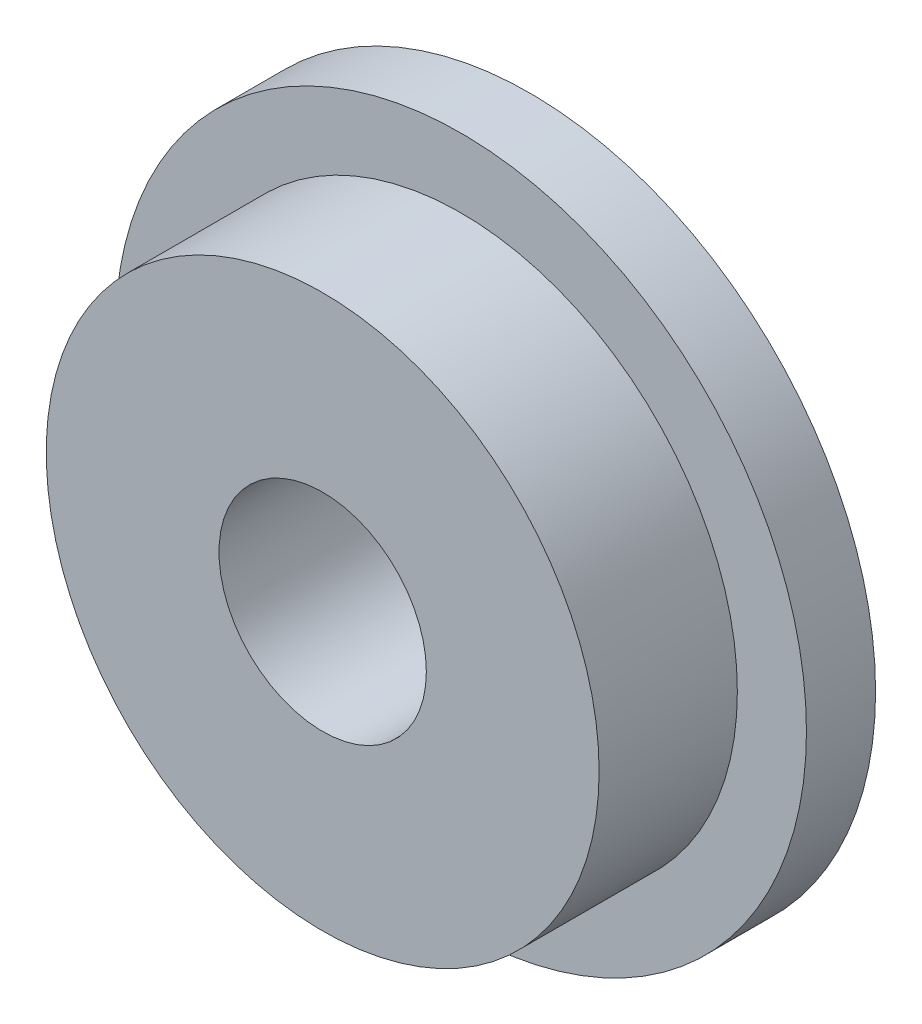
ISO-10303-21;
HEADER;
FILE_DESCRIPTION(('STEP AP214'),'2;1');
FILE_NAME('part.step','',(''),(''),'','','');
FILE_SCHEMA(('AUTOMOTIVE_DESIGN { 1 0 10303 214 1 1 1 1 }'));
ENDSEC;
DATA;
#1=APPLICATION_CONTEXT('core data for automotive mechanical design processes');
#2=APPLICATION_PROTOCOL_DEFINITION('international standard','automotive_design',2000,#1);
#3=PRODUCT_CONTEXT('',#1,'mechanical');
#4=PRODUCT('Part','Part','',(#3));
#5=PRODUCT_RELATED_PRODUCT_CATEGORY('part','',(#4));
#6=PRODUCT_DEFINITION_FORMATION('','',#4);
#7=PRODUCT_DEFINITION_CONTEXT('part definition',#1,'design');
#8=PRODUCT_DEFINITION('design','',#6,#7);
#9=PRODUCT_DEFINITION_SHAPE('','',#8);
#10=(LENGTH_UNIT() NAMED_UNIT(*) SI_UNIT(.MILLI.,.METRE.));
#11=(NAMED_UNIT(*) PLANE_ANGLE_UNIT() SI_UNIT($,.RADIAN.));
#12=(NAMED_UNIT(*) SI_UNIT($,.STERADIAN.) SOLID_ANGLE_UNIT());
#13=UNCERTAINTY_MEASURE_WITH_UNIT(LENGTH_MEASURE(1.E-05),#10,'distance_accuracy_value','');
#14=(GEOMETRIC_REPRESENTATION_CONTEXT(3) GLOBAL_UNCERTAINTY_ASSIGNED_CONTEXT((#13)) GLOBAL_UNIT_ASSIGNED_CONTEXT((#10,
#11,#12)) REPRESENTATION_CONTEXT('',''));
#15=CARTESIAN_POINT('',(0.,0.,0.));
#16=DIRECTION('',(0.,0.,1.));
#17=DIRECTION('',(1.,0.,0.));
#18=AXIS2_PLACEMENT_3D('',#15,#16,#17);
#19=CARTESIAN_POINT('',(0.,0.,1.));
#20=DIRECTION('',(0.,0.,1.));
#21=DIRECTION('',(1.,0.,0.));
#22=AXIS2_PLACEMENT_3D('',#19,#20,#21);
#23=PLANE('',#22);
#24=CARTESIAN_POINT('',(0.,0.,1.));
#25=DIRECTION('',(0.,0.,1.));
#26=DIRECTION('',(1.,0.,0.));
#27=AXIS2_PLACEMENT_3D('',#24,#25,#26);
#28=CIRCLE('',#27,5.);
#29=CARTESIAN_POINT('',(5.,0.,1.));
#30=VERTEX_POINT('',#29);
#31=EDGE_CURVE('E10',#30,#30,#28,.T.);
#32=ORIENTED_EDGE('',*,*,#31,.T.);
#33=EDGE_LOOP('',(#32));
#34=FACE_BOUND('',#33,.T.);
#35=CARTESIAN_POINT('',(0.,0.,1.));
#36=DIRECTION('',(0.,0.,1.));
#37=DIRECTION('',(1.,0.,0.));
#38=AXIS2_PLACEMENT_3D('',#35,#36,#37);
#39=CIRCLE('',#38,4.);
#40=CARTESIAN_POINT('',(4.,0.,1.));
#41=VERTEX_POINT('',#40);
#42=EDGE_CURVE('E48',#41,#41,#39,.T.);
#43=ORIENTED_EDGE('',*,*,#42,.F.);
#44=EDGE_LOOP('',(#43));
#45=FACE_BOUND('',#44,.T.);
#46=ADVANCED_FACE('F28',(#34,#45),#23,.T.);
#47=CARTESIAN_POINT('',(0.,0.,0.));
#48=DIRECTION('',(0.,0.,1.));
#49=DIRECTION('',(1.,0.,0.));
#50=AXIS2_PLACEMENT_3D('',#47,#48,#49);
#51=PLANE('',#50);
#52=CARTESIAN_POINT('',(0.,0.,0.));
#53=DIRECTION('',(0.,0.,1.));
#54=DIRECTION('',(1.,0.,0.));
#55=AXIS2_PLACEMENT_3D('',#52,#53,#54);
#56=CIRCLE('',#55,5.);
#57=CARTESIAN_POINT('',(5.,0.,0.));
#58=VERTEX_POINT('',#57);
#59=EDGE_CURVE('E35',#58,#58,#56,.T.);
#60=ORIENTED_EDGE('',*,*,#59,.F.);
#61=EDGE_LOOP('',(#60));
#62=FACE_BOUND('',#61,.T.);
#63=CARTESIAN_POINT('',(0.,0.,0.));
#64=DIRECTION('',(0.,0.,1.));
#65=DIRECTION('',(1.,0.,0.));
#66=AXIS2_PLACEMENT_3D('',#63,#64,#65);
#67=CIRCLE('',#66,1.5);
#68=CARTESIAN_POINT('',(1.5,0.,0.));
#69=VERTEX_POINT('',#68);
#70=EDGE_CURVE('E39',#69,#69,#67,.T.);
#71=ORIENTED_EDGE('',*,*,#70,.T.);
#72=EDGE_LOOP('',(#71));
#73=FACE_BOUND('',#72,.T.);
#74=ADVANCED_FACE('F70',(#62,#73),#51,.F.);
#75=CARTESIAN_POINT('',(0.,0.,1.));
#76=DIRECTION('',(0.,0.,-1.));
#77=DIRECTION('',(-1.,0.,0.));
#78=AXIS2_PLACEMENT_3D('',#75,#76,#77);
#79=CYLINDRICAL_SURFACE('',#78,5.);
#80=ORIENTED_EDGE('',*,*,#31,.F.);
#81=EDGE_LOOP('',(#80));
#82=FACE_BOUND('',#81,.T.);
#83=ORIENTED_EDGE('',*,*,#59,.T.);
#84=EDGE_LOOP('',(#83));
#85=FACE_BOUND('',#84,.T.);
#86=ADVANCED_FACE('F30',(#82,#85),#79,.T.);
#87=CARTESIAN_POINT('',(0.,0.,1.));
#88=DIRECTION('',(0.,0.,-1.));
#89=DIRECTION('',(-1.,0.,0.));
#90=AXIS2_PLACEMENT_3D('',#87,#88,#89);
#91=CYLINDRICAL_SURFACE('',#90,1.5);
#92=ORIENTED_EDGE('',*,*,#70,.F.);
#93=EDGE_LOOP('',(#92));
#94=FACE_BOUND('',#93,.T.);
#95=CARTESIAN_POINT('',(0.,0.,3.));
#96=DIRECTION('',(0.,0.,1.));
#97=DIRECTION('',(1.,0.,0.));
#98=AXIS2_PLACEMENT_3D('',#95,#96,#97);
#99=CIRCLE('',#98,1.5);
#100=CARTESIAN_POINT('',(1.5,0.,3.));
#101=VERTEX_POINT('',#100);
#102=EDGE_CURVE('E51',#101,#101,#99,.T.);
#103=ORIENTED_EDGE('',*,*,#102,.T.);
#104=EDGE_LOOP('',(#103));
#105=FACE_BOUND('',#104,.T.);
#106=ADVANCED_FACE('F55',(#94,#105),#91,.F.);
#107=CARTESIAN_POINT('',(0.,0.,3.));
#108=DIRECTION('',(0.,0.,-1.));
#109=DIRECTION('',(-1.,0.,0.));
#110=AXIS2_PLACEMENT_3D('',#107,#108,#109);
#111=CYLINDRICAL_SURFACE('',#110,4.);
#112=CARTESIAN_POINT('',(0.,0.,3.));
#113=DIRECTION('',(0.,0.,1.));
#114=DIRECTION('',(1.,0.,0.));
#115=AXIS2_PLACEMENT_3D('',#112,#113,#114);
#116=CIRCLE('',#115,4.);
#117=CARTESIAN_POINT('',(4.,0.,3.));
#118=VERTEX_POINT('',#117);
#119=EDGE_CURVE('E43',#118,#118,#116,.T.);
#120=ORIENTED_EDGE('',*,*,#119,.F.);
#121=EDGE_LOOP('',(#120));
#122=FACE_BOUND('',#121,.T.);
#123=ORIENTED_EDGE('',*,*,#42,.T.);
#124=EDGE_LOOP('',(#123));
#125=FACE_BOUND('',#124,.T.);
#126=ADVANCED_FACE('F60',(#122,#125),#111,.T.);
#127=CARTESIAN_POINT('',(0.,0.,3.));
#128=DIRECTION('',(0.,0.,1.));
#129=DIRECTION('',(1.,0.,0.));
#130=AXIS2_PLACEMENT_3D('',#127,#128,#129);
#131=PLANE('',#130);
#132=ORIENTED_EDGE('',*,*,#102,.F.);
#133=EDGE_LOOP('',(#132));
#134=FACE_BOUND('',#133,.T.);
#135=ORIENTED_EDGE('',*,*,#119,.T.);
#136=EDGE_LOOP('',(#135));
#137=FACE_BOUND('',#136,.T.);
#138=ADVANCED_FACE('F57',(#134,#137),#131,.T.);
#139=CLOSED_SHELL('',(#46,#74,#86,#106,#126,#138));
#140=MANIFOLD_SOLID_BREP('B2',#139);
#141=ADVANCED_BREP_SHAPE_REPRESENTATION('',(#18,#140),#14);
#142=SHAPE_DEFINITION_REPRESENTATION(#9,#141);
ENDSEC;
END-ISO-10303-21;
